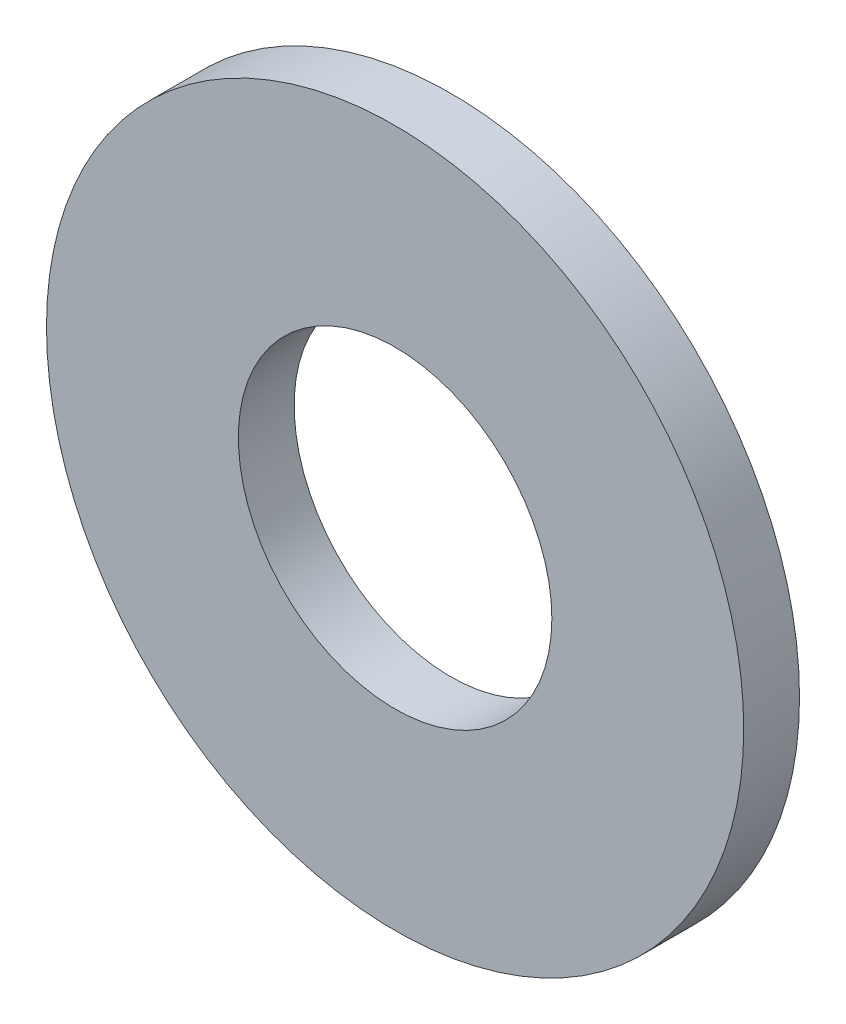
ISO-10303-21;
HEADER;
FILE_DESCRIPTION(('STEP AP214'),'2;1');
FILE_NAME('part.step','',(''),(''),'','','');
FILE_SCHEMA(('AUTOMOTIVE_DESIGN { 1 0 10303 214 1 1 1 1 }'));
ENDSEC;
DATA;
#1=APPLICATION_CONTEXT('core data for automotive mechanical design processes');
#2=APPLICATION_PROTOCOL_DEFINITION('international standard','automotive_design',2000,#1);
#3=PRODUCT_CONTEXT('',#1,'mechanical');
#4=PRODUCT('Part','Part','',(#3));
#5=PRODUCT_RELATED_PRODUCT_CATEGORY('part','',(#4));
#6=PRODUCT_DEFINITION_FORMATION('','',#4);
#7=PRODUCT_DEFINITION_CONTEXT('part definition',#1,'design');
#8=PRODUCT_DEFINITION('design','',#6,#7);
#9=PRODUCT_DEFINITION_SHAPE('','',#8);
#10=(LENGTH_UNIT() NAMED_UNIT(*) SI_UNIT(.MILLI.,.METRE.));
#11=(NAMED_UNIT(*) PLANE_ANGLE_UNIT() SI_UNIT($,.RADIAN.));
#12=(NAMED_UNIT(*) SI_UNIT($,.STERADIAN.) SOLID_ANGLE_UNIT());
#13=UNCERTAINTY_MEASURE_WITH_UNIT(LENGTH_MEASURE(1.E-05),#10,'distance_accuracy_value','');
#14=(GEOMETRIC_REPRESENTATION_CONTEXT(3) GLOBAL_UNCERTAINTY_ASSIGNED_CONTEXT((#13)) GLOBAL_UNIT_ASSIGNED_CONTEXT((#10,
#11,#12)) REPRESENTATION_CONTEXT('',''));
#15=CARTESIAN_POINT('',(0.,0.,0.));
#16=DIRECTION('',(0.,0.,1.));
#17=DIRECTION('',(1.,0.,0.));
#18=AXIS2_PLACEMENT_3D('',#15,#16,#17);
#19=CARTESIAN_POINT('',(0.,0.,0.634999999999997));
#20=DIRECTION('',(0.,0.,1.));
#21=DIRECTION('',(1.,0.,0.));
#22=AXIS2_PLACEMENT_3D('',#19,#20,#21);
#23=PLANE('',#22);
#24=CARTESIAN_POINT('',(0.,0.,0.634999999999997));
#25=DIRECTION('',(0.,0.,1.));
#26=DIRECTION('',(1.,0.,0.));
#27=AXIS2_PLACEMENT_3D('',#24,#25,#26);
#28=CIRCLE('',#27,7.9375);
#29=CARTESIAN_POINT('',(7.9375,0.,0.634999999999997));
#30=VERTEX_POINT('',#29);
#31=EDGE_CURVE('E10',#30,#30,#28,.T.);
#32=ORIENTED_EDGE('',*,*,#31,.T.);
#33=EDGE_LOOP('',(#32));
#34=FACE_BOUND('',#33,.T.);
#35=CARTESIAN_POINT('',(0.,0.,0.634999999999997));
#36=DIRECTION('',(0.,0.,1.));
#37=DIRECTION('',(1.,0.,0.));
#38=AXIS2_PLACEMENT_3D('',#35,#36,#37);
#39=CIRCLE('',#38,3.5687);
#40=CARTESIAN_POINT('',(3.5687,0.,0.634999999999997));
#41=VERTEX_POINT('',#40);
#42=EDGE_CURVE('E52',#41,#41,#39,.T.);
#43=ORIENTED_EDGE('',*,*,#42,.F.);
#44=EDGE_LOOP('',(#43));
#45=FACE_BOUND('',#44,.T.);
#46=ADVANCED_FACE('F45',(#34,#45),#23,.T.);
#47=CARTESIAN_POINT('',(0.,0.,0.634999999999997));
#48=DIRECTION('',(0.,0.,-1.));
#49=DIRECTION('',(-1.,0.,0.));
#50=AXIS2_PLACEMENT_3D('',#47,#48,#49);
#51=CYLINDRICAL_SURFACE('',#50,7.9375);
#52=ORIENTED_EDGE('',*,*,#31,.F.);
#53=EDGE_LOOP('',(#52));
#54=FACE_BOUND('',#53,.T.);
#55=CARTESIAN_POINT('',(0.,0.,-0.635000000000003));
#56=DIRECTION('',(0.,0.,1.));
#57=DIRECTION('',(1.,0.,0.));
#58=AXIS2_PLACEMENT_3D('',#55,#56,#57);
#59=CIRCLE('',#58,7.9375);
#60=CARTESIAN_POINT('',(7.9375,0.,-0.635000000000003));
#61=VERTEX_POINT('',#60);
#62=EDGE_CURVE('E56',#61,#61,#59,.T.);
#63=ORIENTED_EDGE('',*,*,#62,.T.);
#64=EDGE_LOOP('',(#63));
#65=FACE_BOUND('',#64,.T.);
#66=ADVANCED_FACE('F47',(#54,#65),#51,.T.);
#67=CARTESIAN_POINT('',(0.,0.,0.634999999999997));
#68=DIRECTION('',(0.,0.,-1.));
#69=DIRECTION('',(-1.,0.,0.));
#70=AXIS2_PLACEMENT_3D('',#67,#68,#69);
#71=CYLINDRICAL_SURFACE('',#70,3.5687);
#72=ORIENTED_EDGE('',*,*,#42,.T.);
#73=EDGE_LOOP('',(#72));
#74=FACE_BOUND('',#73,.T.);
#75=CARTESIAN_POINT('',(0.,0.,-0.635000000000003));
#76=DIRECTION('',(0.,0.,1.));
#77=DIRECTION('',(1.,0.,0.));
#78=AXIS2_PLACEMENT_3D('',#75,#76,#77);
#79=CIRCLE('',#78,3.5687);
#80=CARTESIAN_POINT('',(3.5687,0.,-0.635000000000003));
#81=VERTEX_POINT('',#80);
#82=EDGE_CURVE('E60',#81,#81,#79,.T.);
#83=ORIENTED_EDGE('',*,*,#82,.F.);
#84=EDGE_LOOP('',(#83));
#85=FACE_BOUND('',#84,.T.);
#86=ADVANCED_FACE('F69',(#74,#85),#71,.F.);
#87=CARTESIAN_POINT('',(0.,0.,-0.635000000000003));
#88=DIRECTION('',(0.,0.,1.));
#89=DIRECTION('',(1.,0.,0.));
#90=AXIS2_PLACEMENT_3D('',#87,#88,#89);
#91=PLANE('',#90);
#92=ORIENTED_EDGE('',*,*,#82,.T.);
#93=EDGE_LOOP('',(#92));
#94=FACE_BOUND('',#93,.T.);
#95=ORIENTED_EDGE('',*,*,#62,.F.);
#96=EDGE_LOOP('',(#95));
#97=FACE_BOUND('',#96,.T.);
#98=ADVANCED_FACE('F66',(#94,#97),#91,.F.);
#99=CLOSED_SHELL('',(#46,#66,#86,#98));
#100=MANIFOLD_SOLID_BREP('B2',#99);
#101=ADVANCED_BREP_SHAPE_REPRESENTATION('',(#18,#100),#14);
#102=SHAPE_DEFINITION_REPRESENTATION(#9,#101);
ENDSEC;
END-ISO-10303-21;
